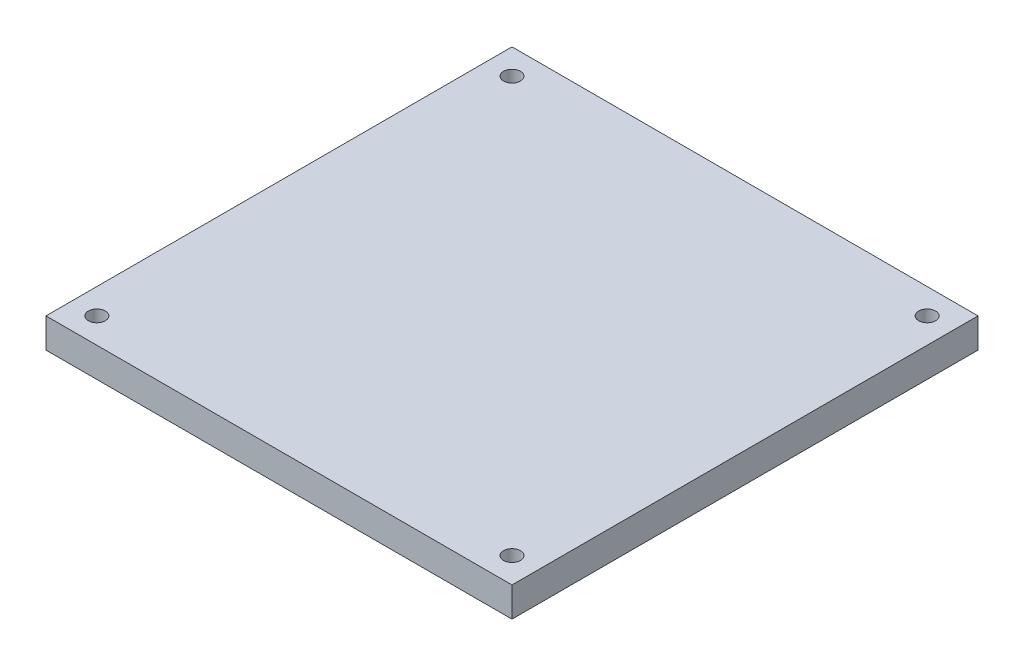
ISO-10303-21;
HEADER;
FILE_DESCRIPTION(('STEP AP214'),'2;1');
FILE_NAME('part.step','',(''),(''),'','','');
FILE_SCHEMA(('AUTOMOTIVE_DESIGN { 1 0 10303 214 1 1 1 1 }'));
ENDSEC;
DATA;
#1=APPLICATION_CONTEXT('core data for automotive mechanical design processes');
#2=APPLICATION_PROTOCOL_DEFINITION('international standard','automotive_design',2000,#1);
#3=PRODUCT_CONTEXT('',#1,'mechanical');
#4=PRODUCT('Part','Part','',(#3));
#5=PRODUCT_RELATED_PRODUCT_CATEGORY('part','',(#4));
#6=PRODUCT_DEFINITION_FORMATION('','',#4);
#7=PRODUCT_DEFINITION_CONTEXT('part definition',#1,'design');
#8=PRODUCT_DEFINITION('design','',#6,#7);
#9=PRODUCT_DEFINITION_SHAPE('','',#8);
#10=(LENGTH_UNIT() NAMED_UNIT(*) SI_UNIT(.MILLI.,.METRE.));
#11=(NAMED_UNIT(*) PLANE_ANGLE_UNIT() SI_UNIT($,.RADIAN.));
#12=(NAMED_UNIT(*) SI_UNIT($,.STERADIAN.) SOLID_ANGLE_UNIT());
#13=UNCERTAINTY_MEASURE_WITH_UNIT(LENGTH_MEASURE(1.E-05),#10,'distance_accuracy_value','');
#14=(GEOMETRIC_REPRESENTATION_CONTEXT(3) GLOBAL_UNCERTAINTY_ASSIGNED_CONTEXT((#13)) GLOBAL_UNIT_ASSIGNED_CONTEXT((#10,
#11,#12)) REPRESENTATION_CONTEXT('',''));
#15=CARTESIAN_POINT('',(0.,0.,0.));
#16=DIRECTION('',(0.,0.,1.));
#17=DIRECTION('',(1.,0.,0.));
#18=AXIS2_PLACEMENT_3D('',#15,#16,#17);
#19=CARTESIAN_POINT('',(83.4783234697371,7.,-31.7251665519029));
#20=DIRECTION('',(0.,0.,1.));
#21=DIRECTION('',(1.,0.,0.));
#22=AXIS2_PLACEMENT_3D('',#19,#20,#21);
#23=PLANE('',#22);
#24=DIRECTION('',(-1.,0.,0.));
#25=VECTOR('',#24,1.);
#26=CARTESIAN_POINT('',(83.4783234697371,0.,-31.7251665519029));
#27=LINE('',#26,#25);
#28=CARTESIAN_POINT('',(83.4783234697371,0.,-31.7251665519029));
#29=VERTEX_POINT('',#28);
#30=CARTESIAN_POINT('',(-26.5216765302629,0.,-31.7251665519029));
#31=VERTEX_POINT('',#30);
#32=EDGE_CURVE('E100',#29,#31,#27,.T.);
#33=ORIENTED_EDGE('',*,*,#32,.T.);
#34=DIRECTION('',(0.,-1.,0.));
#35=VECTOR('',#34,1.);
#36=CARTESIAN_POINT('',(-26.5216765302629,7.,-31.7251665519029));
#37=LINE('',#36,#35);
#38=CARTESIAN_POINT('',(-26.5216765302629,7.,-31.7251665519029));
#39=VERTEX_POINT('',#38);
#40=EDGE_CURVE('E11',#39,#31,#37,.T.);
#41=ORIENTED_EDGE('',*,*,#40,.F.);
#42=DIRECTION('',(-1.,0.,0.));
#43=VECTOR('',#42,1.);
#44=CARTESIAN_POINT('',(83.4783234697371,7.,-31.7251665519029));
#45=LINE('',#44,#43);
#46=CARTESIAN_POINT('',(83.4783234697371,7.,-31.7251665519029));
#47=VERTEX_POINT('',#46);
#48=EDGE_CURVE('E88',#47,#39,#45,.T.);
#49=ORIENTED_EDGE('',*,*,#48,.F.);
#50=DIRECTION('',(0.,-1.,0.));
#51=VECTOR('',#50,1.);
#52=CARTESIAN_POINT('',(83.4783234697371,7.,-31.7251665519029));
#53=LINE('',#52,#51);
#54=EDGE_CURVE('E96',#47,#29,#53,.T.);
#55=ORIENTED_EDGE('',*,*,#54,.T.);
#56=EDGE_LOOP('',(#33,#41,#49,#55));
#57=FACE_BOUND('',#56,.T.);
#58=ADVANCED_FACE('F37',(#57),#23,.F.);
#59=CARTESIAN_POINT('',(-26.5216765302629,7.,-31.7251665519029));
#60=DIRECTION('',(1.,0.,0.));
#61=DIRECTION('',(0.,0.,-1.));
#62=AXIS2_PLACEMENT_3D('',#59,#60,#61);
#63=PLANE('',#62);
#64=DIRECTION('',(0.,0.,1.));
#65=VECTOR('',#64,1.);
#66=CARTESIAN_POINT('',(-26.5216765302629,0.,-31.7251665519029));
#67=LINE('',#66,#65);
#68=CARTESIAN_POINT('',(-26.5216765302629,0.,78.2748334480971));
#69=VERTEX_POINT('',#68);
#70=EDGE_CURVE('E92',#31,#69,#67,.T.);
#71=ORIENTED_EDGE('',*,*,#70,.T.);
#72=DIRECTION('',(0.,-1.,0.));
#73=VECTOR('',#72,1.);
#74=CARTESIAN_POINT('',(-26.5216765302629,7.,78.2748334480971));
#75=LINE('',#74,#73);
#76=CARTESIAN_POINT('',(-26.5216765302629,7.,78.2748334480971));
#77=VERTEX_POINT('',#76);
#78=EDGE_CURVE('E45',#77,#69,#75,.T.);
#79=ORIENTED_EDGE('',*,*,#78,.F.);
#80=DIRECTION('',(0.,0.,1.));
#81=VECTOR('',#80,1.);
#82=CARTESIAN_POINT('',(-26.5216765302629,7.,-31.7251665519029));
#83=LINE('',#82,#81);
#84=EDGE_CURVE('E83',#39,#77,#83,.T.);
#85=ORIENTED_EDGE('',*,*,#84,.F.);
#86=ORIENTED_EDGE('',*,*,#40,.T.);
#87=EDGE_LOOP('',(#71,#79,#85,#86));
#88=FACE_BOUND('',#87,.T.);
#89=ADVANCED_FACE('F91',(#88),#63,.F.);
#90=CARTESIAN_POINT('',(-26.5216765302629,7.,78.2748334480971));
#91=DIRECTION('',(0.,0.,-1.));
#92=DIRECTION('',(-1.,0.,0.));
#93=AXIS2_PLACEMENT_3D('',#90,#91,#92);
#94=PLANE('',#93);
#95=DIRECTION('',(1.,0.,0.));
#96=VECTOR('',#95,1.);
#97=CARTESIAN_POINT('',(-26.5216765302629,0.,78.2748334480971));
#98=LINE('',#97,#96);
#99=CARTESIAN_POINT('',(83.4783234697371,0.,78.2748334480971));
#100=VERTEX_POINT('',#99);
#101=EDGE_CURVE('E70',#69,#100,#98,.T.);
#102=ORIENTED_EDGE('',*,*,#101,.T.);
#103=DIRECTION('',(0.,-1.,0.));
#104=VECTOR('',#103,1.);
#105=CARTESIAN_POINT('',(83.4783234697371,7.,78.2748334480971));
#106=LINE('',#105,#104);
#107=CARTESIAN_POINT('',(83.4783234697371,7.,78.2748334480971));
#108=VERTEX_POINT('',#107);
#109=EDGE_CURVE('E93',#108,#100,#106,.T.);
#110=ORIENTED_EDGE('',*,*,#109,.F.);
#111=DIRECTION('',(1.,0.,0.));
#112=VECTOR('',#111,1.);
#113=CARTESIAN_POINT('',(-26.5216765302629,7.,78.2748334480971));
#114=LINE('',#113,#112);
#115=EDGE_CURVE('E86',#77,#108,#114,.T.);
#116=ORIENTED_EDGE('',*,*,#115,.F.);
#117=ORIENTED_EDGE('',*,*,#78,.T.);
#118=EDGE_LOOP('',(#102,#110,#116,#117));
#119=FACE_BOUND('',#118,.T.);
#120=ADVANCED_FACE('F94',(#119),#94,.F.);
#121=CARTESIAN_POINT('',(83.4783234697371,7.,78.2748334480971));
#122=DIRECTION('',(-1.,0.,0.));
#123=DIRECTION('',(0.,0.,1.));
#124=AXIS2_PLACEMENT_3D('',#121,#122,#123);
#125=PLANE('',#124);
#126=DIRECTION('',(0.,0.,-1.));
#127=VECTOR('',#126,1.);
#128=CARTESIAN_POINT('',(83.4783234697371,0.,78.2748334480971));
#129=LINE('',#128,#127);
#130=EDGE_CURVE('E76',#100,#29,#129,.T.);
#131=ORIENTED_EDGE('',*,*,#130,.T.);
#132=ORIENTED_EDGE('',*,*,#54,.F.);
#133=DIRECTION('',(0.,0.,-1.));
#134=VECTOR('',#133,1.);
#135=CARTESIAN_POINT('',(83.4783234697371,7.,78.2748334480971));
#136=LINE('',#135,#134);
#137=EDGE_CURVE('E53',#108,#47,#136,.T.);
#138=ORIENTED_EDGE('',*,*,#137,.F.);
#139=ORIENTED_EDGE('',*,*,#109,.T.);
#140=EDGE_LOOP('',(#131,#132,#138,#139));
#141=FACE_BOUND('',#140,.T.);
#142=ADVANCED_FACE('F108',(#141),#125,.F.);
#143=CARTESIAN_POINT('',(0.,7.,0.));
#144=DIRECTION('',(0.,1.,0.));
#145=DIRECTION('',(0.,0.,1.));
#146=AXIS2_PLACEMENT_3D('',#143,#144,#145);
#147=PLANE('',#146);
#148=CARTESIAN_POINT('',(77.4783234697371,7.,72.2748334480971));
#149=DIRECTION('',(0.,1.,0.));
#150=DIRECTION('',(0.,0.,1.));
#151=AXIS2_PLACEMENT_3D('',#148,#149,#150);
#152=CIRCLE('',#151,2.);
#153=CARTESIAN_POINT('',(77.4783234697371,7.,74.2748334480971));
#154=VERTEX_POINT('',#153);
#155=EDGE_CURVE('E120',#154,#154,#152,.T.);
#156=ORIENTED_EDGE('',*,*,#155,.F.);
#157=EDGE_LOOP('',(#156));
#158=FACE_BOUND('',#157,.T.);
#159=CARTESIAN_POINT('',(77.4783234697371,7.,-25.7251665519029));
#160=DIRECTION('',(0.,1.,0.));
#161=DIRECTION('',(0.,0.,1.));
#162=AXIS2_PLACEMENT_3D('',#159,#160,#161);
#163=CIRCLE('',#162,2.);
#164=CARTESIAN_POINT('',(77.4783234697371,7.,-23.7251665519029));
#165=VERTEX_POINT('',#164);
#166=EDGE_CURVE('E126',#165,#165,#163,.T.);
#167=ORIENTED_EDGE('',*,*,#166,.F.);
#168=EDGE_LOOP('',(#167));
#169=FACE_BOUND('',#168,.T.);
#170=CARTESIAN_POINT('',(-20.5216765302629,7.,-25.7251665519029));
#171=DIRECTION('',(0.,1.,0.));
#172=DIRECTION('',(0.,0.,1.));
#173=AXIS2_PLACEMENT_3D('',#170,#171,#172);
#174=CIRCLE('',#173,2.);
#175=CARTESIAN_POINT('',(-20.5216765302629,7.,-23.7251665519029));
#176=VERTEX_POINT('',#175);
#177=EDGE_CURVE('E132',#176,#176,#174,.T.);
#178=ORIENTED_EDGE('',*,*,#177,.F.);
#179=EDGE_LOOP('',(#178));
#180=FACE_BOUND('',#179,.T.);
#181=CARTESIAN_POINT('',(-20.5216765302629,7.,72.2748334480971));
#182=DIRECTION('',(0.,1.,0.));
#183=DIRECTION('',(0.,0.,1.));
#184=AXIS2_PLACEMENT_3D('',#181,#182,#183);
#185=CIRCLE('',#184,2.);
#186=CARTESIAN_POINT('',(-20.5216765302629,7.,74.2748334480971));
#187=VERTEX_POINT('',#186);
#188=EDGE_CURVE('E114',#187,#187,#185,.T.);
#189=ORIENTED_EDGE('',*,*,#188,.F.);
#190=EDGE_LOOP('',(#189));
#191=FACE_BOUND('',#190,.T.);
#192=ORIENTED_EDGE('',*,*,#48,.T.);
#193=ORIENTED_EDGE('',*,*,#84,.T.);
#194=ORIENTED_EDGE('',*,*,#115,.T.);
#195=ORIENTED_EDGE('',*,*,#137,.T.);
#196=EDGE_LOOP('',(#192,#193,#194,#195));
#197=FACE_BOUND('',#196,.T.);
#198=ADVANCED_FACE('F84',(#158,#169,#180,#191,#197),#147,.T.);
#199=CARTESIAN_POINT('',(0.,0.,0.));
#200=DIRECTION('',(0.,1.,0.));
#201=DIRECTION('',(0.,0.,1.));
#202=AXIS2_PLACEMENT_3D('',#199,#200,#201);
#203=PLANE('',#202);
#204=CARTESIAN_POINT('',(77.4783234697371,0.,72.2748334480971));
#205=DIRECTION('',(0.,1.,0.));
#206=DIRECTION('',(0.,0.,1.));
#207=AXIS2_PLACEMENT_3D('',#204,#205,#206);
#208=CIRCLE('',#207,2.);
#209=CARTESIAN_POINT('',(77.4783234697371,0.,74.2748334480971));
#210=VERTEX_POINT('',#209);
#211=EDGE_CURVE('E123',#210,#210,#208,.T.);
#212=ORIENTED_EDGE('',*,*,#211,.T.);
#213=EDGE_LOOP('',(#212));
#214=FACE_BOUND('',#213,.T.);
#215=CARTESIAN_POINT('',(77.4783234697371,0.,-25.7251665519029));
#216=DIRECTION('',(0.,1.,0.));
#217=DIRECTION('',(0.,0.,1.));
#218=AXIS2_PLACEMENT_3D('',#215,#216,#217);
#219=CIRCLE('',#218,2.);
#220=CARTESIAN_POINT('',(77.4783234697371,0.,-23.7251665519029));
#221=VERTEX_POINT('',#220);
#222=EDGE_CURVE('E129',#221,#221,#219,.T.);
#223=ORIENTED_EDGE('',*,*,#222,.T.);
#224=EDGE_LOOP('',(#223));
#225=FACE_BOUND('',#224,.T.);
#226=CARTESIAN_POINT('',(-20.5216765302629,0.,-25.7251665519029));
#227=DIRECTION('',(0.,1.,0.));
#228=DIRECTION('',(0.,0.,1.));
#229=AXIS2_PLACEMENT_3D('',#226,#227,#228);
#230=CIRCLE('',#229,2.);
#231=CARTESIAN_POINT('',(-20.5216765302629,0.,-23.7251665519029));
#232=VERTEX_POINT('',#231);
#233=EDGE_CURVE('E117',#232,#232,#230,.T.);
#234=ORIENTED_EDGE('',*,*,#233,.T.);
#235=EDGE_LOOP('',(#234));
#236=FACE_BOUND('',#235,.T.);
#237=CARTESIAN_POINT('',(-20.5216765302629,0.,72.2748334480971));
#238=DIRECTION('',(0.,1.,0.));
#239=DIRECTION('',(0.,0.,1.));
#240=AXIS2_PLACEMENT_3D('',#237,#238,#239);
#241=CIRCLE('',#240,2.);
#242=CARTESIAN_POINT('',(-20.5216765302629,0.,74.2748334480971));
#243=VERTEX_POINT('',#242);
#244=EDGE_CURVE('E103',#243,#243,#241,.T.);
#245=ORIENTED_EDGE('',*,*,#244,.T.);
#246=EDGE_LOOP('',(#245));
#247=FACE_BOUND('',#246,.T.);
#248=ORIENTED_EDGE('',*,*,#32,.F.);
#249=ORIENTED_EDGE('',*,*,#130,.F.);
#250=ORIENTED_EDGE('',*,*,#101,.F.);
#251=ORIENTED_EDGE('',*,*,#70,.F.);
#252=EDGE_LOOP('',(#248,#249,#250,#251));
#253=FACE_BOUND('',#252,.T.);
#254=ADVANCED_FACE('F111',(#214,#225,#236,#247,#253),#203,.F.);
#255=CARTESIAN_POINT('',(-20.5216765302629,0.,72.2748334480971));
#256=DIRECTION('',(0.,1.,0.));
#257=DIRECTION('',(0.,0.,1.));
#258=AXIS2_PLACEMENT_3D('',#255,#256,#257);
#259=CYLINDRICAL_SURFACE('',#258,2.);
#260=ORIENTED_EDGE('',*,*,#244,.F.);
#261=EDGE_LOOP('',(#260));
#262=FACE_BOUND('',#261,.T.);
#263=ORIENTED_EDGE('',*,*,#188,.T.);
#264=EDGE_LOOP('',(#263));
#265=FACE_BOUND('',#264,.T.);
#266=ADVANCED_FACE('F144',(#262,#265),#259,.F.);
#267=CARTESIAN_POINT('',(-20.5216765302629,0.,-25.7251665519029));
#268=DIRECTION('',(0.,1.,0.));
#269=DIRECTION('',(0.,0.,1.));
#270=AXIS2_PLACEMENT_3D('',#267,#268,#269);
#271=CYLINDRICAL_SURFACE('',#270,2.);
#272=ORIENTED_EDGE('',*,*,#233,.F.);
#273=EDGE_LOOP('',(#272));
#274=FACE_BOUND('',#273,.T.);
#275=ORIENTED_EDGE('',*,*,#177,.T.);
#276=EDGE_LOOP('',(#275));
#277=FACE_BOUND('',#276,.T.);
#278=ADVANCED_FACE('F140',(#274,#277),#271,.F.);
#279=CARTESIAN_POINT('',(77.4783234697371,0.,-25.7251665519029));
#280=DIRECTION('',(0.,1.,0.));
#281=DIRECTION('',(0.,0.,1.));
#282=AXIS2_PLACEMENT_3D('',#279,#280,#281);
#283=CYLINDRICAL_SURFACE('',#282,2.);
#284=ORIENTED_EDGE('',*,*,#222,.F.);
#285=EDGE_LOOP('',(#284));
#286=FACE_BOUND('',#285,.T.);
#287=ORIENTED_EDGE('',*,*,#166,.T.);
#288=EDGE_LOOP('',(#287));
#289=FACE_BOUND('',#288,.T.);
#290=ADVANCED_FACE('F143',(#286,#289),#283,.F.);
#291=CARTESIAN_POINT('',(77.4783234697371,0.,72.2748334480971));
#292=DIRECTION('',(0.,1.,0.));
#293=DIRECTION('',(0.,0.,1.));
#294=AXIS2_PLACEMENT_3D('',#291,#292,#293);
#295=CYLINDRICAL_SURFACE('',#294,2.);
#296=ORIENTED_EDGE('',*,*,#211,.F.);
#297=EDGE_LOOP('',(#296));
#298=FACE_BOUND('',#297,.T.);
#299=ORIENTED_EDGE('',*,*,#155,.T.);
#300=EDGE_LOOP('',(#299));
#301=FACE_BOUND('',#300,.T.);
#302=ADVANCED_FACE('F205',(#298,#301),#295,.F.);
#303=CLOSED_SHELL('',(#58,#89,#120,#142,#198,#254,#266,#278,#290,#302));
#304=MANIFOLD_SOLID_BREP('B2',#303);
#305=ADVANCED_BREP_SHAPE_REPRESENTATION('',(#18,#304),#14);
#306=SHAPE_DEFINITION_REPRESENTATION(#9,#305);
ENDSEC;
END-ISO-10303-21;
